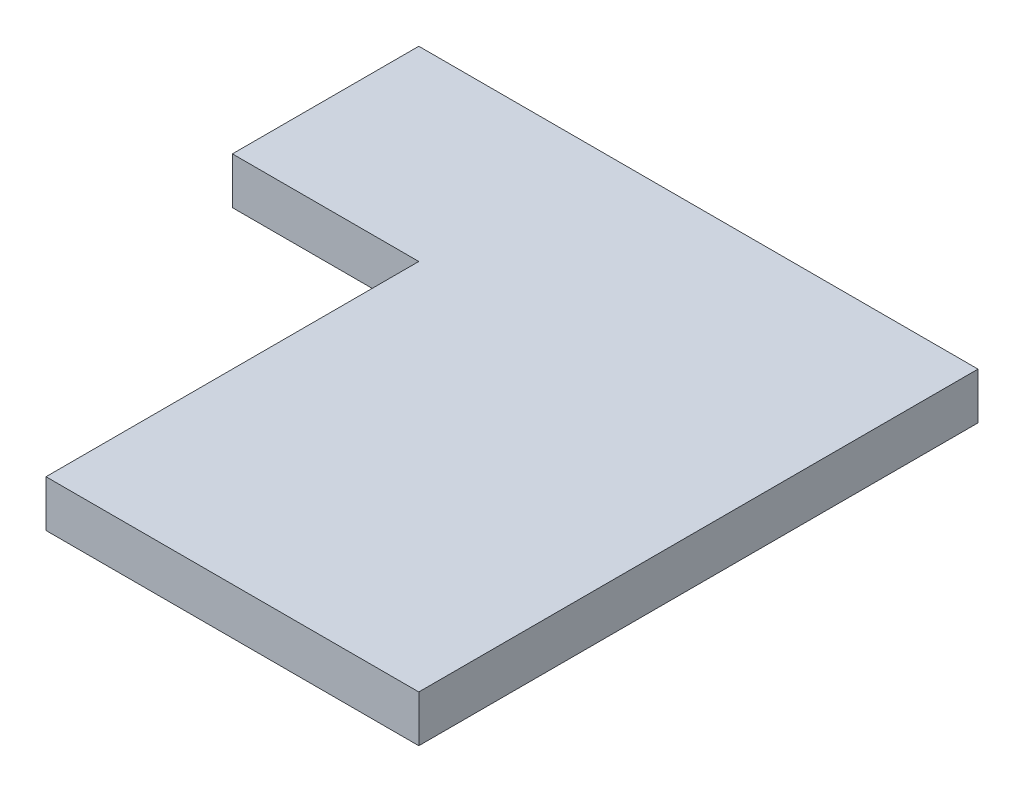
ISO-10303-21;
HEADER;
FILE_DESCRIPTION(('STEP AP214'),'2;1');
FILE_NAME('part.step','',(''),(''),'','','');
FILE_SCHEMA(('AUTOMOTIVE_DESIGN { 1 0 10303 214 1 1 1 1 }'));
ENDSEC;
DATA;
#1=APPLICATION_CONTEXT('core data for automotive mechanical design processes');
#2=APPLICATION_PROTOCOL_DEFINITION('international standard','automotive_design',2000,#1);
#3=PRODUCT_CONTEXT('',#1,'mechanical');
#4=PRODUCT('Part','Part','',(#3));
#5=PRODUCT_RELATED_PRODUCT_CATEGORY('part','',(#4));
#6=PRODUCT_DEFINITION_FORMATION('','',#4);
#7=PRODUCT_DEFINITION_CONTEXT('part definition',#1,'design');
#8=PRODUCT_DEFINITION('design','',#6,#7);
#9=PRODUCT_DEFINITION_SHAPE('','',#8);
#10=(LENGTH_UNIT() NAMED_UNIT(*) SI_UNIT(.MILLI.,.METRE.));
#11=(NAMED_UNIT(*) PLANE_ANGLE_UNIT() SI_UNIT($,.RADIAN.));
#12=(NAMED_UNIT(*) SI_UNIT($,.STERADIAN.) SOLID_ANGLE_UNIT());
#13=UNCERTAINTY_MEASURE_WITH_UNIT(LENGTH_MEASURE(1.E-05),#10,'distance_accuracy_value','');
#14=(GEOMETRIC_REPRESENTATION_CONTEXT(3) GLOBAL_UNCERTAINTY_ASSIGNED_CONTEXT((#13)) GLOBAL_UNIT_ASSIGNED_CONTEXT((#10,
#11,#12)) REPRESENTATION_CONTEXT('',''));
#15=CARTESIAN_POINT('',(0.,0.,0.));
#16=DIRECTION('',(0.,0.,1.));
#17=DIRECTION('',(1.,0.,0.));
#18=AXIS2_PLACEMENT_3D('',#15,#16,#17);
#19=CARTESIAN_POINT('',(-1200.,200.,-1200.));
#20=DIRECTION('',(1.,0.,0.));
#21=DIRECTION('',(0.,0.,-1.));
#22=AXIS2_PLACEMENT_3D('',#19,#20,#21);
#23=PLANE('',#22);
#24=DIRECTION('',(0.,-1.,0.));
#25=VECTOR('',#24,1.);
#26=CARTESIAN_POINT('',(-1200.,200.,-400.));
#27=LINE('',#26,#25);
#28=CARTESIAN_POINT('',(-1200.,200.,-400.));
#29=VERTEX_POINT('',#28);
#30=CARTESIAN_POINT('',(-1200.,0.,-400.));
#31=VERTEX_POINT('',#30);
#32=EDGE_CURVE('E52',#29,#31,#27,.T.);
#33=ORIENTED_EDGE('',*,*,#32,.F.);
#34=DIRECTION('',(0.,0.,1.));
#35=VECTOR('',#34,1.);
#36=CARTESIAN_POINT('',(-1200.,200.,-1200.));
#37=LINE('',#36,#35);
#38=CARTESIAN_POINT('',(-1200.,200.,-1200.));
#39=VERTEX_POINT('',#38);
#40=EDGE_CURVE('E117',#39,#29,#37,.T.);
#41=ORIENTED_EDGE('',*,*,#40,.F.);
#42=DIRECTION('',(0.,-1.,0.));
#43=VECTOR('',#42,1.);
#44=CARTESIAN_POINT('',(-1200.,200.,-1200.));
#45=LINE('',#44,#43);
#46=CARTESIAN_POINT('',(-1200.,0.,-1200.));
#47=VERTEX_POINT('',#46);
#48=EDGE_CURVE('E45',#39,#47,#45,.T.);
#49=ORIENTED_EDGE('',*,*,#48,.T.);
#50=DIRECTION('',(0.,0.,1.));
#51=VECTOR('',#50,1.);
#52=CARTESIAN_POINT('',(-1200.,0.,-1200.));
#53=LINE('',#52,#51);
#54=EDGE_CURVE('E127',#47,#31,#53,.T.);
#55=ORIENTED_EDGE('',*,*,#54,.T.);
#56=EDGE_LOOP('',(#33,#41,#49,#55));
#57=FACE_BOUND('',#56,.T.);
#58=ADVANCED_FACE('F37',(#57),#23,.F.);
#59=CARTESIAN_POINT('',(-1200.,200.,1200.));
#60=DIRECTION('',(0.,0.,-1.));
#61=DIRECTION('',(-1.,0.,0.));
#62=AXIS2_PLACEMENT_3D('',#59,#60,#61);
#63=PLANE('',#62);
#64=DIRECTION('',(0.,-1.,0.));
#65=VECTOR('',#64,1.);
#66=CARTESIAN_POINT('',(-400.,200.,1200.));
#67=LINE('',#66,#65);
#68=CARTESIAN_POINT('',(-400.,200.,1200.));
#69=VERTEX_POINT('',#68);
#70=CARTESIAN_POINT('',(-400.,0.,1200.));
#71=VERTEX_POINT('',#70);
#72=EDGE_CURVE('E99',#69,#71,#67,.T.);
#73=ORIENTED_EDGE('',*,*,#72,.T.);
#74=DIRECTION('',(1.,0.,0.));
#75=VECTOR('',#74,1.);
#76=CARTESIAN_POINT('',(-1200.,0.,1200.));
#77=LINE('',#76,#75);
#78=CARTESIAN_POINT('',(1200.,0.,1200.));
#79=VERTEX_POINT('',#78);
#80=EDGE_CURVE('E79',#71,#79,#77,.T.);
#81=ORIENTED_EDGE('',*,*,#80,.T.);
#82=DIRECTION('',(0.,-1.,0.));
#83=VECTOR('',#82,1.);
#84=CARTESIAN_POINT('',(1200.,200.,1200.));
#85=LINE('',#84,#83);
#86=CARTESIAN_POINT('',(1200.,200.,1200.));
#87=VERTEX_POINT('',#86);
#88=EDGE_CURVE('E115',#87,#79,#85,.T.);
#89=ORIENTED_EDGE('',*,*,#88,.F.);
#90=DIRECTION('',(1.,0.,0.));
#91=VECTOR('',#90,1.);
#92=CARTESIAN_POINT('',(-1200.,200.,1200.));
#93=LINE('',#92,#91);
#94=EDGE_CURVE('E61',#69,#87,#93,.T.);
#95=ORIENTED_EDGE('',*,*,#94,.F.);
#96=EDGE_LOOP('',(#73,#81,#89,#95));
#97=FACE_BOUND('',#96,.T.);
#98=ADVANCED_FACE('F114',(#97),#63,.F.);
#99=CARTESIAN_POINT('',(0.,200.,0.));
#100=DIRECTION('',(0.,1.,0.));
#101=DIRECTION('',(0.,0.,1.));
#102=AXIS2_PLACEMENT_3D('',#99,#100,#101);
#103=PLANE('',#102);
#104=DIRECTION('',(-1.,0.,0.));
#105=VECTOR('',#104,1.);
#106=CARTESIAN_POINT('',(-1200.,200.,-400.));
#107=LINE('',#106,#105);
#108=CARTESIAN_POINT('',(-400.,200.,-400.));
#109=VERTEX_POINT('',#108);
#110=EDGE_CURVE('E111',#109,#29,#107,.T.);
#111=ORIENTED_EDGE('',*,*,#110,.F.);
#112=DIRECTION('',(0.,0.,-1.));
#113=VECTOR('',#112,1.);
#114=CARTESIAN_POINT('',(-400.,200.,-400.));
#115=LINE('',#114,#113);
#116=EDGE_CURVE('E101',#69,#109,#115,.T.);
#117=ORIENTED_EDGE('',*,*,#116,.F.);
#118=ORIENTED_EDGE('',*,*,#94,.T.);
#119=DIRECTION('',(0.,0.,-1.));
#120=VECTOR('',#119,1.);
#121=CARTESIAN_POINT('',(1200.,200.,-1200.));
#122=LINE('',#121,#120);
#123=CARTESIAN_POINT('',(1200.,200.,-1200.));
#124=VERTEX_POINT('',#123);
#125=EDGE_CURVE('E130',#87,#124,#122,.T.);
#126=ORIENTED_EDGE('',*,*,#125,.T.);
#127=DIRECTION('',(-1.,0.,0.));
#128=VECTOR('',#127,1.);
#129=CARTESIAN_POINT('',(-1200.,200.,-1200.));
#130=LINE('',#129,#128);
#131=EDGE_CURVE('E84',#124,#39,#130,.T.);
#132=ORIENTED_EDGE('',*,*,#131,.T.);
#133=ORIENTED_EDGE('',*,*,#40,.T.);
#134=EDGE_LOOP('',(#111,#117,#118,#126,#132,#133));
#135=FACE_BOUND('',#134,.T.);
#136=ADVANCED_FACE('F109',(#135),#103,.T.);
#137=CARTESIAN_POINT('',(0.,0.,0.));
#138=DIRECTION('',(0.,1.,0.));
#139=DIRECTION('',(0.,0.,1.));
#140=AXIS2_PLACEMENT_3D('',#137,#138,#139);
#141=PLANE('',#140);
#142=DIRECTION('',(0.,0.,-1.));
#143=VECTOR('',#142,1.);
#144=CARTESIAN_POINT('',(-400.,0.,-400.));
#145=LINE('',#144,#143);
#146=CARTESIAN_POINT('',(-400.,0.,-400.));
#147=VERTEX_POINT('',#146);
#148=EDGE_CURVE('E104',#71,#147,#145,.T.);
#149=ORIENTED_EDGE('',*,*,#148,.T.);
#150=DIRECTION('',(-1.,0.,0.));
#151=VECTOR('',#150,1.);
#152=CARTESIAN_POINT('',(-1200.,0.,-400.));
#153=LINE('',#152,#151);
#154=EDGE_CURVE('E112',#147,#31,#153,.T.);
#155=ORIENTED_EDGE('',*,*,#154,.T.);
#156=ORIENTED_EDGE('',*,*,#54,.F.);
#157=DIRECTION('',(-1.,0.,0.));
#158=VECTOR('',#157,1.);
#159=CARTESIAN_POINT('',(-1200.,0.,-1200.));
#160=LINE('',#159,#158);
#161=CARTESIAN_POINT('',(1200.,0.,-1200.));
#162=VERTEX_POINT('',#161);
#163=EDGE_CURVE('E125',#162,#47,#160,.T.);
#164=ORIENTED_EDGE('',*,*,#163,.F.);
#165=DIRECTION('',(0.,0.,-1.));
#166=VECTOR('',#165,1.);
#167=CARTESIAN_POINT('',(1200.,0.,-1200.));
#168=LINE('',#167,#166);
#169=EDGE_CURVE('E105',#79,#162,#168,.T.);
#170=ORIENTED_EDGE('',*,*,#169,.F.);
#171=ORIENTED_EDGE('',*,*,#80,.F.);
#172=EDGE_LOOP('',(#149,#155,#156,#164,#170,#171));
#173=FACE_BOUND('',#172,.T.);
#174=ADVANCED_FACE('F136',(#173),#141,.F.);
#175=CARTESIAN_POINT('',(1200.,200.,-1200.));
#176=DIRECTION('',(-1.,0.,0.));
#177=DIRECTION('',(0.,0.,1.));
#178=AXIS2_PLACEMENT_3D('',#175,#176,#177);
#179=PLANE('',#178);
#180=ORIENTED_EDGE('',*,*,#169,.T.);
#181=DIRECTION('',(0.,-1.,0.));
#182=VECTOR('',#181,1.);
#183=CARTESIAN_POINT('',(1200.,200.,-1200.));
#184=LINE('',#183,#182);
#185=EDGE_CURVE('E11',#124,#162,#184,.T.);
#186=ORIENTED_EDGE('',*,*,#185,.F.);
#187=ORIENTED_EDGE('',*,*,#125,.F.);
#188=ORIENTED_EDGE('',*,*,#88,.T.);
#189=EDGE_LOOP('',(#180,#186,#187,#188));
#190=FACE_BOUND('',#189,.T.);
#191=ADVANCED_FACE('F39',(#190),#179,.F.);
#192=CARTESIAN_POINT('',(-1200.,200.,-1200.));
#193=DIRECTION('',(0.,0.,1.));
#194=DIRECTION('',(1.,0.,0.));
#195=AXIS2_PLACEMENT_3D('',#192,#193,#194);
#196=PLANE('',#195);
#197=ORIENTED_EDGE('',*,*,#163,.T.);
#198=ORIENTED_EDGE('',*,*,#48,.F.);
#199=ORIENTED_EDGE('',*,*,#131,.F.);
#200=ORIENTED_EDGE('',*,*,#185,.T.);
#201=EDGE_LOOP('',(#197,#198,#199,#200));
#202=FACE_BOUND('',#201,.T.);
#203=ADVANCED_FACE('F146',(#202),#196,.F.);
#204=CARTESIAN_POINT('',(-400.,200.,-400.));
#205=DIRECTION('',(-1.,0.,0.));
#206=DIRECTION('',(0.,0.,1.));
#207=AXIS2_PLACEMENT_3D('',#204,#205,#206);
#208=PLANE('',#207);
#209=ORIENTED_EDGE('',*,*,#148,.F.);
#210=ORIENTED_EDGE('',*,*,#72,.F.);
#211=ORIENTED_EDGE('',*,*,#116,.T.);
#212=DIRECTION('',(0.,-1.,0.));
#213=VECTOR('',#212,1.);
#214=CARTESIAN_POINT('',(-400.,200.,-400.));
#215=LINE('',#214,#213);
#216=EDGE_CURVE('E106',#109,#147,#215,.T.);
#217=ORIENTED_EDGE('',*,*,#216,.T.);
#218=EDGE_LOOP('',(#209,#210,#211,#217));
#219=FACE_BOUND('',#218,.T.);
#220=ADVANCED_FACE('F100',(#219),#208,.T.);
#221=CARTESIAN_POINT('',(-1200.,200.,-400.));
#222=DIRECTION('',(0.,0.,1.));
#223=DIRECTION('',(1.,0.,0.));
#224=AXIS2_PLACEMENT_3D('',#221,#222,#223);
#225=PLANE('',#224);
#226=ORIENTED_EDGE('',*,*,#154,.F.);
#227=ORIENTED_EDGE('',*,*,#216,.F.);
#228=ORIENTED_EDGE('',*,*,#110,.T.);
#229=ORIENTED_EDGE('',*,*,#32,.T.);
#230=EDGE_LOOP('',(#226,#227,#228,#229));
#231=FACE_BOUND('',#230,.T.);
#232=ADVANCED_FACE('F152',(#231),#225,.T.);
#233=CLOSED_SHELL('',(#58,#98,#136,#174,#191,#203,#220,#232));
#234=MANIFOLD_SOLID_BREP('B2',#233);
#235=ADVANCED_BREP_SHAPE_REPRESENTATION('',(#18,#234),#14);
#236=SHAPE_DEFINITION_REPRESENTATION(#9,#235);
ENDSEC;
END-ISO-10303-21;
